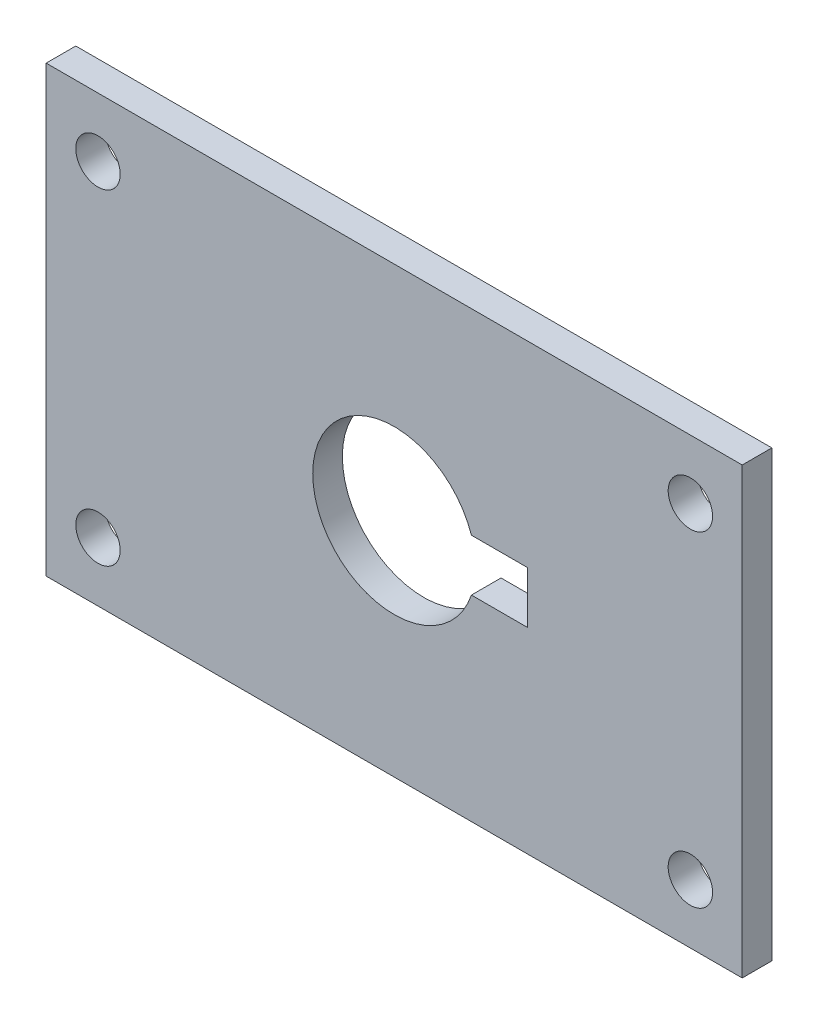
ISO-10303-21;
HEADER;
FILE_DESCRIPTION(('STEP AP214'),'2;1');
FILE_NAME('part.step','',(''),(''),'','','');
FILE_SCHEMA(('AUTOMOTIVE_DESIGN { 1 0 10303 214 1 1 1 1 }'));
ENDSEC;
DATA;
#1=APPLICATION_CONTEXT('core data for automotive mechanical design processes');
#2=APPLICATION_PROTOCOL_DEFINITION('international standard','automotive_design',2000,#1);
#3=PRODUCT_CONTEXT('',#1,'mechanical');
#4=PRODUCT('Part','Part','',(#3));
#5=PRODUCT_RELATED_PRODUCT_CATEGORY('part','',(#4));
#6=PRODUCT_DEFINITION_FORMATION('','',#4);
#7=PRODUCT_DEFINITION_CONTEXT('part definition',#1,'design');
#8=PRODUCT_DEFINITION('design','',#6,#7);
#9=PRODUCT_DEFINITION_SHAPE('','',#8);
#10=(LENGTH_UNIT() NAMED_UNIT(*) SI_UNIT(.MILLI.,.METRE.));
#11=(NAMED_UNIT(*) PLANE_ANGLE_UNIT() SI_UNIT($,.RADIAN.));
#12=(NAMED_UNIT(*) SI_UNIT($,.STERADIAN.) SOLID_ANGLE_UNIT());
#13=UNCERTAINTY_MEASURE_WITH_UNIT(LENGTH_MEASURE(1.E-05),#10,'distance_accuracy_value','');
#14=(GEOMETRIC_REPRESENTATION_CONTEXT(3) GLOBAL_UNCERTAINTY_ASSIGNED_CONTEXT((#13)) GLOBAL_UNIT_ASSIGNED_CONTEXT((#10,
#11,#12)) REPRESENTATION_CONTEXT('',''));
#15=CARTESIAN_POINT('',(0.,0.,0.));
#16=DIRECTION('',(0.,0.,1.));
#17=DIRECTION('',(1.,0.,0.));
#18=AXIS2_PLACEMENT_3D('',#15,#16,#17);
#19=CARTESIAN_POINT('',(0.,0.,2.));
#20=DIRECTION('',(1.,0.,0.));
#21=DIRECTION('',(0.,1.,0.));
#22=AXIS2_PLACEMENT_3D('',#19,#20,#21);
#23=PLANE('',#22);
#24=DIRECTION('',(0.,-1.,0.));
#25=VECTOR('',#24,1.);
#26=CARTESIAN_POINT('',(0.,0.,0.));
#27=LINE('',#26,#25);
#28=CARTESIAN_POINT('',(0.,30.,0.));
#29=VERTEX_POINT('',#28);
#30=CARTESIAN_POINT('',(0.,0.,0.));
#31=VERTEX_POINT('',#30);
#32=EDGE_CURVE('E147',#29,#31,#27,.T.);
#33=ORIENTED_EDGE('',*,*,#32,.T.);
#34=DIRECTION('',(0.,0.,-1.));
#35=VECTOR('',#34,1.);
#36=CARTESIAN_POINT('',(0.,0.,2.));
#37=LINE('',#36,#35);
#38=CARTESIAN_POINT('',(0.,0.,2.));
#39=VERTEX_POINT('',#38);
#40=EDGE_CURVE('E170',#39,#31,#37,.T.);
#41=ORIENTED_EDGE('',*,*,#40,.F.);
#42=DIRECTION('',(0.,-1.,0.));
#43=VECTOR('',#42,1.);
#44=CARTESIAN_POINT('',(0.,0.,2.));
#45=LINE('',#44,#43);
#46=CARTESIAN_POINT('',(0.,30.,2.));
#47=VERTEX_POINT('',#46);
#48=EDGE_CURVE('E150',#47,#39,#45,.T.);
#49=ORIENTED_EDGE('',*,*,#48,.F.);
#50=DIRECTION('',(0.,0.,-1.));
#51=VECTOR('',#50,1.);
#52=CARTESIAN_POINT('',(0.,30.,2.));
#53=LINE('',#52,#51);
#54=EDGE_CURVE('E156',#47,#29,#53,.T.);
#55=ORIENTED_EDGE('',*,*,#54,.T.);
#56=EDGE_LOOP('',(#33,#41,#49,#55));
#57=FACE_BOUND('',#56,.T.);
#58=ADVANCED_FACE('F37',(#57),#23,.F.);
#59=CARTESIAN_POINT('',(0.,0.,2.));
#60=DIRECTION('',(0.,1.,0.));
#61=DIRECTION('',(0.,0.,1.));
#62=AXIS2_PLACEMENT_3D('',#59,#60,#61);
#63=PLANE('',#62);
#64=DIRECTION('',(1.,0.,0.));
#65=VECTOR('',#64,1.);
#66=CARTESIAN_POINT('',(0.,0.,0.));
#67=LINE('',#66,#65);
#68=CARTESIAN_POINT('',(47.,0.,0.));
#69=VERTEX_POINT('',#68);
#70=EDGE_CURVE('E159',#31,#69,#67,.T.);
#71=ORIENTED_EDGE('',*,*,#70,.T.);
#72=DIRECTION('',(0.,0.,-1.));
#73=VECTOR('',#72,1.);
#74=CARTESIAN_POINT('',(47.,0.,2.));
#75=LINE('',#74,#73);
#76=CARTESIAN_POINT('',(47.,0.,2.));
#77=VERTEX_POINT('',#76);
#78=EDGE_CURVE('E167',#77,#69,#75,.T.);
#79=ORIENTED_EDGE('',*,*,#78,.F.);
#80=DIRECTION('',(1.,0.,0.));
#81=VECTOR('',#80,1.);
#82=CARTESIAN_POINT('',(0.,0.,2.));
#83=LINE('',#82,#81);
#84=EDGE_CURVE('E89',#39,#77,#83,.T.);
#85=ORIENTED_EDGE('',*,*,#84,.F.);
#86=ORIENTED_EDGE('',*,*,#40,.T.);
#87=EDGE_LOOP('',(#71,#79,#85,#86));
#88=FACE_BOUND('',#87,.T.);
#89=ADVANCED_FACE('F189',(#88),#63,.F.);
#90=CARTESIAN_POINT('',(47.,0.,2.));
#91=DIRECTION('',(-1.,0.,0.));
#92=DIRECTION('',(0.,0.,1.));
#93=AXIS2_PLACEMENT_3D('',#90,#91,#92);
#94=PLANE('',#93);
#95=DIRECTION('',(0.,1.,0.));
#96=VECTOR('',#95,1.);
#97=CARTESIAN_POINT('',(47.,0.,0.));
#98=LINE('',#97,#96);
#99=CARTESIAN_POINT('',(47.,30.,0.));
#100=VERTEX_POINT('',#99);
#101=EDGE_CURVE('E161',#69,#100,#98,.T.);
#102=ORIENTED_EDGE('',*,*,#101,.T.);
#103=DIRECTION('',(0.,0.,-1.));
#104=VECTOR('',#103,1.);
#105=CARTESIAN_POINT('',(47.,30.,2.));
#106=LINE('',#105,#104);
#107=CARTESIAN_POINT('',(47.,30.,2.));
#108=VERTEX_POINT('',#107);
#109=EDGE_CURVE('E165',#108,#100,#106,.T.);
#110=ORIENTED_EDGE('',*,*,#109,.F.);
#111=DIRECTION('',(0.,1.,0.));
#112=VECTOR('',#111,1.);
#113=CARTESIAN_POINT('',(47.,0.,2.));
#114=LINE('',#113,#112);
#115=EDGE_CURVE('E153',#77,#108,#114,.T.);
#116=ORIENTED_EDGE('',*,*,#115,.F.);
#117=ORIENTED_EDGE('',*,*,#78,.T.);
#118=EDGE_LOOP('',(#102,#110,#116,#117));
#119=FACE_BOUND('',#118,.T.);
#120=ADVANCED_FACE('F194',(#119),#94,.F.);
#121=CARTESIAN_POINT('',(0.,30.,2.));
#122=DIRECTION('',(0.,-1.,0.));
#123=DIRECTION('',(0.,0.,-1.));
#124=AXIS2_PLACEMENT_3D('',#121,#122,#123);
#125=PLANE('',#124);
#126=DIRECTION('',(-1.,0.,0.));
#127=VECTOR('',#126,1.);
#128=CARTESIAN_POINT('',(0.,30.,0.));
#129=LINE('',#128,#127);
#130=EDGE_CURVE('E81',#100,#29,#129,.T.);
#131=ORIENTED_EDGE('',*,*,#130,.T.);
#132=ORIENTED_EDGE('',*,*,#54,.F.);
#133=DIRECTION('',(-1.,0.,0.));
#134=VECTOR('',#133,1.);
#135=CARTESIAN_POINT('',(0.,30.,2.));
#136=LINE('',#135,#134);
#137=EDGE_CURVE('E60',#108,#47,#136,.T.);
#138=ORIENTED_EDGE('',*,*,#137,.F.);
#139=ORIENTED_EDGE('',*,*,#109,.T.);
#140=EDGE_LOOP('',(#131,#132,#138,#139));
#141=FACE_BOUND('',#140,.T.);
#142=ADVANCED_FACE('F203',(#141),#125,.F.);
#143=CARTESIAN_POINT('',(0.,0.,2.));
#144=DIRECTION('',(0.,0.,-1.));
#145=DIRECTION('',(-1.,0.,0.));
#146=AXIS2_PLACEMENT_3D('',#143,#144,#145);
#147=PLANE('',#146);
#148=CARTESIAN_POINT('',(3.49999999999992,26.,2.));
#149=DIRECTION('',(0.,0.,1.));
#150=DIRECTION('',(1.,0.,0.));
#151=AXIS2_PLACEMENT_3D('',#148,#149,#150);
#152=CIRCLE('',#151,1.5);
#153=CARTESIAN_POINT('',(4.99999999999992,26.,2.));
#154=VERTEX_POINT('',#153);
#155=EDGE_CURVE('E307',#154,#154,#152,.T.);
#156=ORIENTED_EDGE('',*,*,#155,.F.);
#157=EDGE_LOOP('',(#156));
#158=FACE_BOUND('',#157,.T.);
#159=CARTESIAN_POINT('',(43.4999999999999,26.,2.));
#160=DIRECTION('',(0.,0.,1.));
#161=DIRECTION('',(1.,0.,0.));
#162=AXIS2_PLACEMENT_3D('',#159,#160,#161);
#163=CIRCLE('',#162,1.5);
#164=CARTESIAN_POINT('',(44.9999999999999,26.,2.));
#165=VERTEX_POINT('',#164);
#166=EDGE_CURVE('E309',#165,#165,#163,.T.);
#167=ORIENTED_EDGE('',*,*,#166,.F.);
#168=EDGE_LOOP('',(#167));
#169=FACE_BOUND('',#168,.T.);
#170=CARTESIAN_POINT('',(43.5,4.,2.));
#171=DIRECTION('',(0.,0.,1.));
#172=DIRECTION('',(1.,0.,0.));
#173=AXIS2_PLACEMENT_3D('',#170,#171,#172);
#174=CIRCLE('',#173,1.5);
#175=CARTESIAN_POINT('',(45.,4.,2.));
#176=VERTEX_POINT('',#175);
#177=EDGE_CURVE('E320',#176,#176,#174,.T.);
#178=ORIENTED_EDGE('',*,*,#177,.F.);
#179=EDGE_LOOP('',(#178));
#180=FACE_BOUND('',#179,.T.);
#181=CARTESIAN_POINT('',(3.5,4.,2.));
#182=DIRECTION('',(0.,0.,1.));
#183=DIRECTION('',(1.,0.,0.));
#184=AXIS2_PLACEMENT_3D('',#181,#182,#183);
#185=CIRCLE('',#184,1.5);
#186=CARTESIAN_POINT('',(5.,4.,2.));
#187=VERTEX_POINT('',#186);
#188=EDGE_CURVE('E136',#187,#187,#185,.T.);
#189=ORIENTED_EDGE('',*,*,#188,.F.);
#190=EDGE_LOOP('',(#189));
#191=FACE_BOUND('',#190,.T.);
#192=DIRECTION('',(0.,1.,0.));
#193=VECTOR('',#192,1.);
#194=CARTESIAN_POINT('',(32.5,16.75,2.));
#195=LINE('',#194,#193);
#196=CARTESIAN_POINT('',(32.5,13.25,2.));
#197=VERTEX_POINT('',#196);
#198=CARTESIAN_POINT('',(32.5,16.75,2.));
#199=VERTEX_POINT('',#198);
#200=EDGE_CURVE('E119',#197,#199,#195,.T.);
#201=ORIENTED_EDGE('',*,*,#200,.F.);
#202=DIRECTION('',(1.,0.,0.));
#203=VECTOR('',#202,1.);
#204=CARTESIAN_POINT('',(25.5,13.25,2.));
#205=LINE('',#204,#203);
#206=CARTESIAN_POINT('',(28.7141634036536,13.25,2.));
#207=VERTEX_POINT('',#206);
#208=EDGE_CURVE('E132',#207,#197,#205,.T.);
#209=ORIENTED_EDGE('',*,*,#208,.F.);
#210=CARTESIAN_POINT('',(23.5,15.,2.));
#211=DIRECTION('',(0.,0.,1.));
#212=DIRECTION('',(1.,0.,0.));
#213=AXIS2_PLACEMENT_3D('',#210,#211,#212);
#214=CIRCLE('',#213,5.5);
#215=CARTESIAN_POINT('',(28.7141634036536,16.75,2.));
#216=VERTEX_POINT('',#215);
#217=EDGE_CURVE('E143',#216,#207,#214,.T.);
#218=ORIENTED_EDGE('',*,*,#217,.F.);
#219=DIRECTION('',(-1.,0.,0.));
#220=VECTOR('',#219,1.);
#221=CARTESIAN_POINT('',(25.5,16.75,2.));
#222=LINE('',#221,#220);
#223=EDGE_CURVE('E51',#199,#216,#222,.T.);
#224=ORIENTED_EDGE('',*,*,#223,.F.);
#225=EDGE_LOOP('',(#201,#209,#218,#224));
#226=FACE_BOUND('',#225,.T.);
#227=ORIENTED_EDGE('',*,*,#48,.T.);
#228=ORIENTED_EDGE('',*,*,#84,.T.);
#229=ORIENTED_EDGE('',*,*,#115,.T.);
#230=ORIENTED_EDGE('',*,*,#137,.T.);
#231=EDGE_LOOP('',(#227,#228,#229,#230));
#232=FACE_BOUND('',#231,.T.);
#233=ADVANCED_FACE('F176',(#158,#169,#180,#191,#226,#232),#147,.F.);
#234=CARTESIAN_POINT('',(0.,0.,0.));
#235=DIRECTION('',(0.,0.,-1.));
#236=DIRECTION('',(-1.,0.,0.));
#237=AXIS2_PLACEMENT_3D('',#234,#235,#236);
#238=PLANE('',#237);
#239=CARTESIAN_POINT('',(3.49999999999992,26.,0.));
#240=DIRECTION('',(0.,0.,1.));
#241=DIRECTION('',(1.,0.,0.));
#242=AXIS2_PLACEMENT_3D('',#239,#240,#241);
#243=CIRCLE('',#242,1.5);
#244=CARTESIAN_POINT('',(4.99999999999992,26.,0.));
#245=VERTEX_POINT('',#244);
#246=EDGE_CURVE('E305',#245,#245,#243,.T.);
#247=ORIENTED_EDGE('',*,*,#246,.T.);
#248=EDGE_LOOP('',(#247));
#249=FACE_BOUND('',#248,.T.);
#250=CARTESIAN_POINT('',(43.4999999999999,26.,0.));
#251=DIRECTION('',(0.,0.,1.));
#252=DIRECTION('',(1.,0.,0.));
#253=AXIS2_PLACEMENT_3D('',#250,#251,#252);
#254=CIRCLE('',#253,1.5);
#255=CARTESIAN_POINT('',(44.9999999999999,26.,0.));
#256=VERTEX_POINT('',#255);
#257=EDGE_CURVE('E325',#256,#256,#254,.T.);
#258=ORIENTED_EDGE('',*,*,#257,.T.);
#259=EDGE_LOOP('',(#258));
#260=FACE_BOUND('',#259,.T.);
#261=CARTESIAN_POINT('',(43.5,4.,0.));
#262=DIRECTION('',(0.,0.,1.));
#263=DIRECTION('',(1.,0.,0.));
#264=AXIS2_PLACEMENT_3D('',#261,#262,#263);
#265=CIRCLE('',#264,1.5);
#266=CARTESIAN_POINT('',(45.,4.,0.));
#267=VERTEX_POINT('',#266);
#268=EDGE_CURVE('E316',#267,#267,#265,.T.);
#269=ORIENTED_EDGE('',*,*,#268,.T.);
#270=EDGE_LOOP('',(#269));
#271=FACE_BOUND('',#270,.T.);
#272=CARTESIAN_POINT('',(3.5,4.,0.));
#273=DIRECTION('',(0.,0.,1.));
#274=DIRECTION('',(1.,0.,0.));
#275=AXIS2_PLACEMENT_3D('',#272,#273,#274);
#276=CIRCLE('',#275,1.5);
#277=CARTESIAN_POINT('',(5.,4.,0.));
#278=VERTEX_POINT('',#277);
#279=EDGE_CURVE('E141',#278,#278,#276,.T.);
#280=ORIENTED_EDGE('',*,*,#279,.T.);
#281=EDGE_LOOP('',(#280));
#282=FACE_BOUND('',#281,.T.);
#283=DIRECTION('',(1.,0.,0.));
#284=VECTOR('',#283,1.);
#285=CARTESIAN_POINT('',(25.5,13.25,0.));
#286=LINE('',#285,#284);
#287=CARTESIAN_POINT('',(28.7141634036536,13.25,0.));
#288=VERTEX_POINT('',#287);
#289=CARTESIAN_POINT('',(32.5,13.25,0.));
#290=VERTEX_POINT('',#289);
#291=EDGE_CURVE('E121',#288,#290,#286,.T.);
#292=ORIENTED_EDGE('',*,*,#291,.T.);
#293=DIRECTION('',(0.,1.,0.));
#294=VECTOR('',#293,1.);
#295=CARTESIAN_POINT('',(32.5,16.75,0.));
#296=LINE('',#295,#294);
#297=CARTESIAN_POINT('',(32.5,16.75,0.));
#298=VERTEX_POINT('',#297);
#299=EDGE_CURVE('E116',#290,#298,#296,.T.);
#300=ORIENTED_EDGE('',*,*,#299,.T.);
#301=DIRECTION('',(-1.,0.,0.));
#302=VECTOR('',#301,1.);
#303=CARTESIAN_POINT('',(25.5,16.75,0.));
#304=LINE('',#303,#302);
#305=CARTESIAN_POINT('',(28.7141634036536,16.75,0.));
#306=VERTEX_POINT('',#305);
#307=EDGE_CURVE('E124',#298,#306,#304,.T.);
#308=ORIENTED_EDGE('',*,*,#307,.T.);
#309=CARTESIAN_POINT('',(23.5,15.,0.));
#310=DIRECTION('',(0.,0.,1.));
#311=DIRECTION('',(1.,0.,0.));
#312=AXIS2_PLACEMENT_3D('',#309,#310,#311);
#313=CIRCLE('',#312,5.5);
#314=EDGE_CURVE('E145',#306,#288,#313,.T.);
#315=ORIENTED_EDGE('',*,*,#314,.T.);
#316=EDGE_LOOP('',(#292,#300,#308,#315));
#317=FACE_BOUND('',#316,.T.);
#318=ORIENTED_EDGE('',*,*,#32,.F.);
#319=ORIENTED_EDGE('',*,*,#130,.F.);
#320=ORIENTED_EDGE('',*,*,#101,.F.);
#321=ORIENTED_EDGE('',*,*,#70,.F.);
#322=EDGE_LOOP('',(#318,#319,#320,#321));
#323=FACE_BOUND('',#322,.T.);
#324=ADVANCED_FACE('F130',(#249,#260,#271,#282,#317,#323),#238,.T.);
#325=CARTESIAN_POINT('',(23.5,15.,0.));
#326=DIRECTION('',(0.,0.,1.));
#327=DIRECTION('',(1.,0.,0.));
#328=AXIS2_PLACEMENT_3D('',#325,#326,#327);
#329=CYLINDRICAL_SURFACE('',#328,5.5);
#330=ORIENTED_EDGE('',*,*,#217,.T.);
#331=DIRECTION('',(0.,0.,1.));
#332=VECTOR('',#331,1.);
#333=CARTESIAN_POINT('',(28.7141634036536,13.25,0.));
#334=LINE('',#333,#332);
#335=EDGE_CURVE('E11',#207,#288,#334,.F.);
#336=ORIENTED_EDGE('',*,*,#335,.T.);
#337=ORIENTED_EDGE('',*,*,#314,.F.);
#338=DIRECTION('',(0.,0.,1.));
#339=VECTOR('',#338,1.);
#340=CARTESIAN_POINT('',(28.7141634036536,16.75,0.));
#341=LINE('',#340,#339);
#342=EDGE_CURVE('E44',#306,#216,#341,.T.);
#343=ORIENTED_EDGE('',*,*,#342,.T.);
#344=EDGE_LOOP('',(#330,#336,#337,#343));
#345=FACE_BOUND('',#344,.T.);
#346=ADVANCED_FACE('F173',(#345),#329,.F.);
#347=CARTESIAN_POINT('',(25.5,13.25,0.));
#348=DIRECTION('',(0.,-1.,0.));
#349=DIRECTION('',(0.,0.,-1.));
#350=AXIS2_PLACEMENT_3D('',#347,#348,#349);
#351=PLANE('',#350);
#352=ORIENTED_EDGE('',*,*,#208,.T.);
#353=DIRECTION('',(0.,0.,1.));
#354=VECTOR('',#353,1.);
#355=CARTESIAN_POINT('',(32.5,13.25,0.));
#356=LINE('',#355,#354);
#357=EDGE_CURVE('E120',#290,#197,#356,.T.);
#358=ORIENTED_EDGE('',*,*,#357,.F.);
#359=ORIENTED_EDGE('',*,*,#291,.F.);
#360=ORIENTED_EDGE('',*,*,#335,.F.);
#361=EDGE_LOOP('',(#352,#358,#359,#360));
#362=FACE_BOUND('',#361,.T.);
#363=ADVANCED_FACE('F178',(#362),#351,.F.);
#364=CARTESIAN_POINT('',(25.5,16.75,0.));
#365=DIRECTION('',(0.,1.,0.));
#366=DIRECTION('',(0.,0.,1.));
#367=AXIS2_PLACEMENT_3D('',#364,#365,#366);
#368=PLANE('',#367);
#369=ORIENTED_EDGE('',*,*,#307,.F.);
#370=DIRECTION('',(0.,0.,1.));
#371=VECTOR('',#370,1.);
#372=CARTESIAN_POINT('',(32.5,16.75,0.));
#373=LINE('',#372,#371);
#374=EDGE_CURVE('E111',#298,#199,#373,.T.);
#375=ORIENTED_EDGE('',*,*,#374,.T.);
#376=ORIENTED_EDGE('',*,*,#223,.T.);
#377=ORIENTED_EDGE('',*,*,#342,.F.);
#378=EDGE_LOOP('',(#369,#375,#376,#377));
#379=FACE_BOUND('',#378,.T.);
#380=ADVANCED_FACE('F125',(#379),#368,.F.);
#381=CARTESIAN_POINT('',(32.5,16.75,0.));
#382=DIRECTION('',(1.,0.,0.));
#383=DIRECTION('',(0.,0.,-1.));
#384=AXIS2_PLACEMENT_3D('',#381,#382,#383);
#385=PLANE('',#384);
#386=ORIENTED_EDGE('',*,*,#200,.T.);
#387=ORIENTED_EDGE('',*,*,#374,.F.);
#388=ORIENTED_EDGE('',*,*,#299,.F.);
#389=ORIENTED_EDGE('',*,*,#357,.T.);
#390=EDGE_LOOP('',(#386,#387,#388,#389));
#391=FACE_BOUND('',#390,.T.);
#392=ADVANCED_FACE('F113',(#391),#385,.F.);
#393=CARTESIAN_POINT('',(3.5,4.,0.));
#394=DIRECTION('',(0.,0.,1.));
#395=DIRECTION('',(1.,0.,0.));
#396=AXIS2_PLACEMENT_3D('',#393,#394,#395);
#397=CYLINDRICAL_SURFACE('',#396,1.5);
#398=ORIENTED_EDGE('',*,*,#279,.F.);
#399=EDGE_LOOP('',(#398));
#400=FACE_BOUND('',#399,.T.);
#401=ORIENTED_EDGE('',*,*,#188,.T.);
#402=EDGE_LOOP('',(#401));
#403=FACE_BOUND('',#402,.T.);
#404=ADVANCED_FACE('F252',(#400,#403),#397,.F.);
#405=CARTESIAN_POINT('',(43.5,4.,0.));
#406=DIRECTION('',(0.,0.,1.));
#407=DIRECTION('',(1.,0.,0.));
#408=AXIS2_PLACEMENT_3D('',#405,#406,#407);
#409=CYLINDRICAL_SURFACE('',#408,1.5);
#410=ORIENTED_EDGE('',*,*,#268,.F.);
#411=EDGE_LOOP('',(#410));
#412=FACE_BOUND('',#411,.T.);
#413=ORIENTED_EDGE('',*,*,#177,.T.);
#414=EDGE_LOOP('',(#413));
#415=FACE_BOUND('',#414,.T.);
#416=ADVANCED_FACE('F269',(#412,#415),#409,.F.);
#417=CARTESIAN_POINT('',(43.4999999999999,26.,0.));
#418=DIRECTION('',(0.,0.,1.));
#419=DIRECTION('',(1.,0.,0.));
#420=AXIS2_PLACEMENT_3D('',#417,#418,#419);
#421=CYLINDRICAL_SURFACE('',#420,1.5);
#422=ORIENTED_EDGE('',*,*,#257,.F.);
#423=EDGE_LOOP('',(#422));
#424=FACE_BOUND('',#423,.T.);
#425=ORIENTED_EDGE('',*,*,#166,.T.);
#426=EDGE_LOOP('',(#425));
#427=FACE_BOUND('',#426,.T.);
#428=ADVANCED_FACE('F278',(#424,#427),#421,.F.);
#429=CARTESIAN_POINT('',(3.49999999999992,26.,0.));
#430=DIRECTION('',(0.,0.,1.));
#431=DIRECTION('',(1.,0.,0.));
#432=AXIS2_PLACEMENT_3D('',#429,#430,#431);
#433=CYLINDRICAL_SURFACE('',#432,1.5);
#434=ORIENTED_EDGE('',*,*,#246,.F.);
#435=EDGE_LOOP('',(#434));
#436=FACE_BOUND('',#435,.T.);
#437=ORIENTED_EDGE('',*,*,#155,.T.);
#438=EDGE_LOOP('',(#437));
#439=FACE_BOUND('',#438,.T.);
#440=ADVANCED_FACE('F288',(#436,#439),#433,.F.);
#441=CLOSED_SHELL('',(#58,#89,#120,#142,#233,#324,#346,#363,#380,#392,#404,#416,#428,#440));
#442=MANIFOLD_SOLID_BREP('B2',#441);
#443=ADVANCED_BREP_SHAPE_REPRESENTATION('',(#18,#442),#14);
#444=SHAPE_DEFINITION_REPRESENTATION(#9,#443);
ENDSEC;
END-ISO-10303-21;
